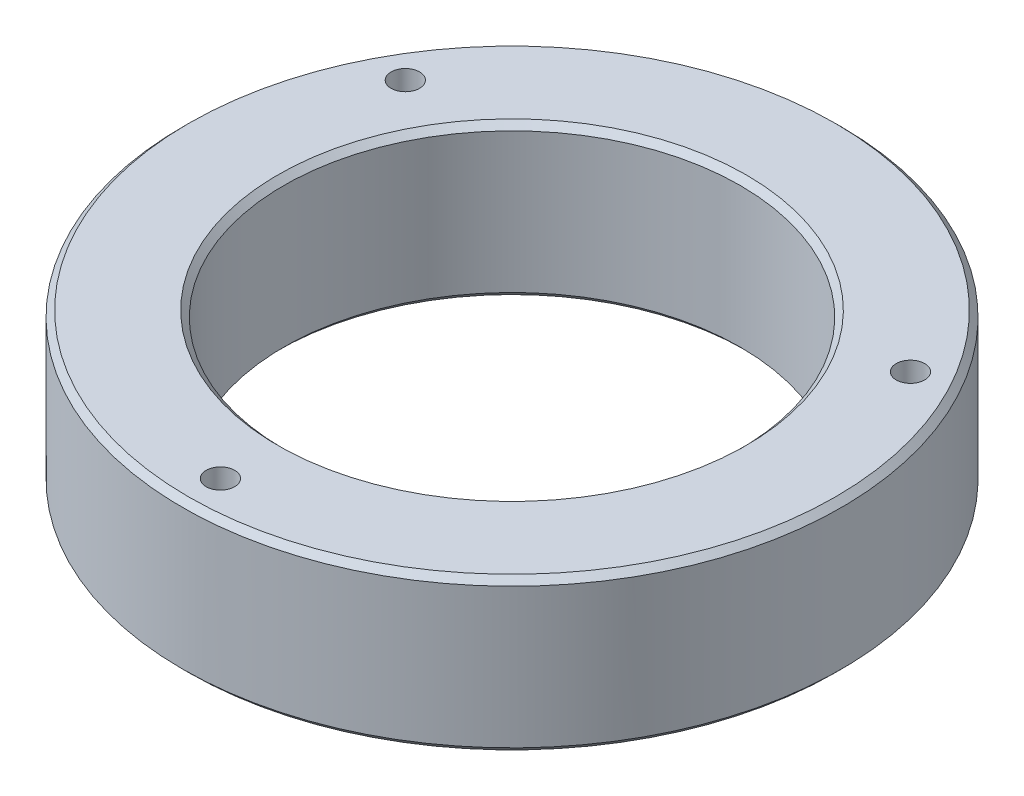
ISO-10303-21;
HEADER;
FILE_DESCRIPTION(('STEP AP214'),'2;1');
FILE_NAME('part.step','',(''),(''),'','','');
FILE_SCHEMA(('AUTOMOTIVE_DESIGN { 1 0 10303 214 1 1 1 1 }'));
ENDSEC;
DATA;
#1=APPLICATION_CONTEXT('core data for automotive mechanical design processes');
#2=APPLICATION_PROTOCOL_DEFINITION('international standard','automotive_design',2000,#1);
#3=PRODUCT_CONTEXT('',#1,'mechanical');
#4=PRODUCT('Part','Part','',(#3));
#5=PRODUCT_RELATED_PRODUCT_CATEGORY('part','',(#4));
#6=PRODUCT_DEFINITION_FORMATION('','',#4);
#7=PRODUCT_DEFINITION_CONTEXT('part definition',#1,'design');
#8=PRODUCT_DEFINITION('design','',#6,#7);
#9=PRODUCT_DEFINITION_SHAPE('','',#8);
#10=(LENGTH_UNIT() NAMED_UNIT(*) SI_UNIT(.MILLI.,.METRE.));
#11=(NAMED_UNIT(*) PLANE_ANGLE_UNIT() SI_UNIT($,.RADIAN.));
#12=(NAMED_UNIT(*) SI_UNIT($,.STERADIAN.) SOLID_ANGLE_UNIT());
#13=UNCERTAINTY_MEASURE_WITH_UNIT(LENGTH_MEASURE(1.E-05),#10,'distance_accuracy_value','');
#14=(GEOMETRIC_REPRESENTATION_CONTEXT(3) GLOBAL_UNCERTAINTY_ASSIGNED_CONTEXT((#13)) GLOBAL_UNIT_ASSIGNED_CONTEXT((#10,
#11,#12)) REPRESENTATION_CONTEXT('',''));
#15=CARTESIAN_POINT('',(0.,0.,0.));
#16=DIRECTION('',(0.,0.,1.));
#17=DIRECTION('',(1.,0.,0.));
#18=AXIS2_PLACEMENT_3D('',#15,#16,#17);
#19=CARTESIAN_POINT('',(-57.15,-19.05,0.));
#20=DIRECTION('',(0.,1.,0.));
#21=DIRECTION('',(0.,0.,1.));
#22=AXIS2_PLACEMENT_3D('',#19,#20,#21);
#23=PLANE('',#22);
#24=CARTESIAN_POINT('',(69.85,-19.05,0.));
#25=DIRECTION('',(0.,-1.,0.));
#26=DIRECTION('',(0.,0.,-1.));
#27=AXIS2_PLACEMENT_3D('',#24,#25,#26);
#28=CIRCLE('',#27,3.96874999999999);
#29=CARTESIAN_POINT('',(69.85,-19.05,-3.96874999999999));
#30=VERTEX_POINT('',#29);
#31=EDGE_CURVE('E73',#30,#30,#28,.T.);
#32=ORIENTED_EDGE('',*,*,#31,.F.);
#33=EDGE_LOOP('',(#32));
#34=FACE_BOUND('',#33,.T.);
#35=CARTESIAN_POINT('',(-69.85,-19.05,0.));
#36=DIRECTION('',(0.,-1.,0.));
#37=DIRECTION('',(0.,0.,-1.));
#38=AXIS2_PLACEMENT_3D('',#35,#36,#37);
#39=CIRCLE('',#38,3.96874999999999);
#40=CARTESIAN_POINT('',(-69.85,-19.05,-3.96874999999999));
#41=VERTEX_POINT('',#40);
#42=EDGE_CURVE('E72',#41,#41,#39,.T.);
#43=ORIENTED_EDGE('',*,*,#42,.F.);
#44=EDGE_LOOP('',(#43));
#45=FACE_BOUND('',#44,.T.);
#46=CARTESIAN_POINT('',(0.,-19.05,73.025));
#47=DIRECTION('',(0.,-1.,0.));
#48=DIRECTION('',(0.,0.,-1.));
#49=AXIS2_PLACEMENT_3D('',#46,#47,#48);
#50=CIRCLE('',#49,5.56259999999999);
#51=CARTESIAN_POINT('',(0.,-19.05,67.4624));
#52=VERTEX_POINT('',#51);
#53=EDGE_CURVE('E83',#52,#52,#50,.T.);
#54=ORIENTED_EDGE('',*,*,#53,.F.);
#55=EDGE_LOOP('',(#54));
#56=FACE_BOUND('',#55,.T.);
#57=CARTESIAN_POINT('',(63.246,-19.05,-36.5252));
#58=DIRECTION('',(0.,-1.,0.));
#59=DIRECTION('',(0.,0.,-1.));
#60=AXIS2_PLACEMENT_3D('',#57,#58,#59);
#61=CIRCLE('',#60,5.5626);
#62=CARTESIAN_POINT('',(63.246,-19.05,-42.0878));
#63=VERTEX_POINT('',#62);
#64=EDGE_CURVE('E95',#63,#63,#61,.T.);
#65=ORIENTED_EDGE('',*,*,#64,.F.);
#66=EDGE_LOOP('',(#65));
#67=FACE_BOUND('',#66,.T.);
#68=CARTESIAN_POINT('',(-63.246,-19.05,-36.5252));
#69=DIRECTION('',(0.,-1.,0.));
#70=DIRECTION('',(0.,0.,-1.));
#71=AXIS2_PLACEMENT_3D('',#68,#69,#70);
#72=CIRCLE('',#71,5.56259999999999);
#73=CARTESIAN_POINT('',(-63.246,-19.05,-42.0878));
#74=VERTEX_POINT('',#73);
#75=EDGE_CURVE('E107',#74,#74,#72,.T.);
#76=ORIENTED_EDGE('',*,*,#75,.F.);
#77=EDGE_LOOP('',(#76));
#78=FACE_BOUND('',#77,.T.);
#79=CARTESIAN_POINT('',(0.,-19.05,0.));
#80=DIRECTION('',(0.,1.,0.));
#81=DIRECTION('',(0.,0.,1.));
#82=AXIS2_PLACEMENT_3D('',#79,#80,#81);
#83=CIRCLE('',#82,58.674);
#84=CARTESIAN_POINT('',(0.,-19.05,-58.674));
#85=VERTEX_POINT('',#84);
#86=EDGE_CURVE('E134',#85,#85,#83,.T.);
#87=ORIENTED_EDGE('',*,*,#86,.T.);
#88=EDGE_LOOP('',(#87));
#89=FACE_BOUND('',#88,.T.);
#90=CARTESIAN_POINT('',(0.,-19.05,0.));
#91=DIRECTION('',(0.,1.,0.));
#92=DIRECTION('',(0.,0.,1.));
#93=AXIS2_PLACEMENT_3D('',#90,#91,#92);
#94=CIRCLE('',#93,81.0006);
#95=CARTESIAN_POINT('',(0.,-19.05,81.0006));
#96=VERTEX_POINT('',#95);
#97=EDGE_CURVE('E131',#96,#96,#94,.F.);
#98=ORIENTED_EDGE('',*,*,#97,.T.);
#99=EDGE_LOOP('',(#98));
#100=FACE_BOUND('',#99,.T.);
#101=ADVANCED_FACE('F47',(#34,#45,#56,#67,#78,#89,#100),#23,.F.);
#102=CARTESIAN_POINT('',(0.,-44.45,0.));
#103=DIRECTION('',(0.,-1.,0.));
#104=DIRECTION('',(0.,0.,-1.));
#105=AXIS2_PLACEMENT_3D('',#102,#103,#104);
#106=CYLINDRICAL_SURFACE('',#105,82.5246);
#107=CARTESIAN_POINT('',(0.,17.526,0.));
#108=DIRECTION('',(0.,-1.,0.));
#109=DIRECTION('',(0.,0.,-1.));
#110=AXIS2_PLACEMENT_3D('',#107,#108,#109);
#111=CIRCLE('',#110,82.5246);
#112=CARTESIAN_POINT('',(0.,17.526,-82.5246));
#113=VERTEX_POINT('',#112);
#114=EDGE_CURVE('E11',#113,#113,#111,.T.);
#115=ORIENTED_EDGE('',*,*,#114,.T.);
#116=EDGE_LOOP('',(#115));
#117=FACE_BOUND('',#116,.T.);
#118=CARTESIAN_POINT('',(0.,-17.526,0.));
#119=DIRECTION('',(0.,1.,0.));
#120=DIRECTION('',(0.,0.,1.));
#121=AXIS2_PLACEMENT_3D('',#118,#119,#120);
#122=CIRCLE('',#121,82.5246);
#123=CARTESIAN_POINT('',(0.,-17.526,82.5246));
#124=VERTEX_POINT('',#123);
#125=EDGE_CURVE('E56',#124,#124,#122,.T.);
#126=ORIENTED_EDGE('',*,*,#125,.T.);
#127=EDGE_LOOP('',(#126));
#128=FACE_BOUND('',#127,.T.);
#129=ADVANCED_FACE('F139',(#117,#128),#106,.T.);
#130=CARTESIAN_POINT('',(-82.5246,19.05,0.));
#131=DIRECTION('',(0.,-1.,0.));
#132=DIRECTION('',(0.,0.,-1.));
#133=AXIS2_PLACEMENT_3D('',#130,#131,#132);
#134=PLANE('',#133);
#135=CARTESIAN_POINT('',(0.,19.05,73.025));
#136=DIRECTION('',(0.,-1.,0.));
#137=DIRECTION('',(0.,0.,-1.));
#138=AXIS2_PLACEMENT_3D('',#135,#136,#137);
#139=CIRCLE('',#138,3.56869999999999);
#140=CARTESIAN_POINT('',(0.,19.05,69.4563));
#141=VERTEX_POINT('',#140);
#142=EDGE_CURVE('E92',#141,#141,#139,.T.);
#143=ORIENTED_EDGE('',*,*,#142,.T.);
#144=EDGE_LOOP('',(#143));
#145=FACE_BOUND('',#144,.T.);
#146=CARTESIAN_POINT('',(63.246,19.05,-36.5252));
#147=DIRECTION('',(0.,-1.,0.));
#148=DIRECTION('',(0.,0.,-1.));
#149=AXIS2_PLACEMENT_3D('',#146,#147,#148);
#150=CIRCLE('',#149,3.56869999999999);
#151=CARTESIAN_POINT('',(63.246,19.05,-40.0939));
#152=VERTEX_POINT('',#151);
#153=EDGE_CURVE('E104',#152,#152,#150,.T.);
#154=ORIENTED_EDGE('',*,*,#153,.T.);
#155=EDGE_LOOP('',(#154));
#156=FACE_BOUND('',#155,.T.);
#157=CARTESIAN_POINT('',(-63.246,19.05,-36.5252));
#158=DIRECTION('',(0.,-1.,0.));
#159=DIRECTION('',(0.,0.,-1.));
#160=AXIS2_PLACEMENT_3D('',#157,#158,#159);
#161=CIRCLE('',#160,3.56869999999999);
#162=CARTESIAN_POINT('',(-63.246,19.05,-40.0939));
#163=VERTEX_POINT('',#162);
#164=EDGE_CURVE('E116',#163,#163,#161,.T.);
#165=ORIENTED_EDGE('',*,*,#164,.T.);
#166=EDGE_LOOP('',(#165));
#167=FACE_BOUND('',#166,.T.);
#168=CARTESIAN_POINT('',(0.,19.05,0.));
#169=DIRECTION('',(0.,-1.,0.));
#170=DIRECTION('',(0.,0.,-1.));
#171=AXIS2_PLACEMENT_3D('',#168,#169,#170);
#172=CIRCLE('',#171,58.674);
#173=CARTESIAN_POINT('',(0.,19.05,-58.674));
#174=VERTEX_POINT('',#173);
#175=EDGE_CURVE('E122',#174,#174,#172,.T.);
#176=ORIENTED_EDGE('',*,*,#175,.T.);
#177=EDGE_LOOP('',(#176));
#178=FACE_BOUND('',#177,.T.);
#179=CARTESIAN_POINT('',(0.,19.05,0.));
#180=DIRECTION('',(0.,-1.,0.));
#181=DIRECTION('',(0.,0.,-1.));
#182=AXIS2_PLACEMENT_3D('',#179,#180,#181);
#183=CIRCLE('',#182,81.0006);
#184=CARTESIAN_POINT('',(0.,19.05,-81.0006));
#185=VERTEX_POINT('',#184);
#186=EDGE_CURVE('E119',#185,#185,#183,.F.);
#187=ORIENTED_EDGE('',*,*,#186,.T.);
#188=EDGE_LOOP('',(#187));
#189=FACE_BOUND('',#188,.T.);
#190=ADVANCED_FACE('F153',(#145,#156,#167,#178,#189),#134,.F.);
#191=CARTESIAN_POINT('',(0.,-44.45,0.));
#192=DIRECTION('',(0.,-1.,0.));
#193=DIRECTION('',(0.,0.,-1.));
#194=AXIS2_PLACEMENT_3D('',#191,#192,#193);
#195=CYLINDRICAL_SURFACE('',#194,57.15);
#196=CARTESIAN_POINT('',(0.,17.526,0.));
#197=DIRECTION('',(0.,-1.,0.));
#198=DIRECTION('',(0.,0.,-1.));
#199=AXIS2_PLACEMENT_3D('',#196,#197,#198);
#200=CIRCLE('',#199,57.15);
#201=CARTESIAN_POINT('',(0.,17.526,-57.15));
#202=VERTEX_POINT('',#201);
#203=EDGE_CURVE('E128',#202,#202,#200,.F.);
#204=CARTESIAN_POINT('',(0.,-17.526,0.));
#205=DIRECTION('',(0.,1.,0.));
#206=DIRECTION('',(0.,0.,1.));
#207=AXIS2_PLACEMENT_3D('',#204,#205,#206);
#208=CIRCLE('',#207,57.15);
#209=CARTESIAN_POINT('',(0.,-17.526,-57.15));
#210=VERTEX_POINT('',#209);
#211=EDGE_CURVE('E125',#210,#210,#208,.F.);
#212=CARTESIAN_POINT('',(0.,17.526,-57.15));
#213=CARTESIAN_POINT('',(0.,17.160875,-57.15));
#214=CARTESIAN_POINT('',(0.,16.79575,-57.15));
#215=CARTESIAN_POINT('',(0.,16.0655,-57.15));
#216=CARTESIAN_POINT('',(0.,15.700375,-57.15));
#217=CARTESIAN_POINT('',(0.,14.970125,-57.15));
#218=CARTESIAN_POINT('',(0.,14.605,-57.15));
#219=CARTESIAN_POINT('',(0.,13.87475,-57.15));
#220=CARTESIAN_POINT('',(0.,13.509625,-57.15));
#221=CARTESIAN_POINT('',(0.,12.779375,-57.15));
#222=CARTESIAN_POINT('',(0.,12.41425,-57.15));
#223=CARTESIAN_POINT('',(0.,11.684,-57.15));
#224=CARTESIAN_POINT('',(0.,11.318875,-57.15));
#225=CARTESIAN_POINT('',(0.,10.588625,-57.15));
#226=CARTESIAN_POINT('',(0.,10.2235,-57.15));
#227=CARTESIAN_POINT('',(0.,9.49324999999998,-57.15));
#228=CARTESIAN_POINT('',(0.,9.12812499999998,-57.15));
#229=CARTESIAN_POINT('',(0.,8.39787499999998,-57.15));
#230=CARTESIAN_POINT('',(0.,8.03274999999998,-57.15));
#231=CARTESIAN_POINT('',(0.,7.30249999999998,-57.15));
#232=CARTESIAN_POINT('',(0.,6.93737499999998,-57.15));
#233=CARTESIAN_POINT('',(0.,6.20712499999998,-57.15));
#234=CARTESIAN_POINT('',(0.,5.84199999999998,-57.15));
#235=CARTESIAN_POINT('',(0.,5.11174999999998,-57.15));
#236=CARTESIAN_POINT('',(0.,4.74662499999998,-57.15));
#237=CARTESIAN_POINT('',(0.,4.01637499999998,-57.15));
#238=CARTESIAN_POINT('',(0.,3.65124999999998,-57.15));
#239=CARTESIAN_POINT('',(0.,2.92099999999998,-57.15));
#240=CARTESIAN_POINT('',(0.,2.55587499999998,-57.15));
#241=CARTESIAN_POINT('',(0.,1.82562499999998,-57.15));
#242=CARTESIAN_POINT('',(0.,1.46049999999998,-57.15));
#243=CARTESIAN_POINT('',(0.,0.730249999999976,-57.15));
#244=CARTESIAN_POINT('',(0.,0.365124999999978,-57.15));
#245=CARTESIAN_POINT('',(0.,-0.365125000000019,-57.15));
#246=CARTESIAN_POINT('',(0.,-0.730250000000018,-57.15));
#247=CARTESIAN_POINT('',(0.,-1.46050000000002,-57.15));
#248=CARTESIAN_POINT('',(0.,-1.82562500000002,-57.15));
#249=CARTESIAN_POINT('',(0.,-2.55587500000002,-57.15));
#250=CARTESIAN_POINT('',(0.,-2.92100000000002,-57.15));
#251=CARTESIAN_POINT('',(0.,-3.65125000000002,-57.15));
#252=CARTESIAN_POINT('',(0.,-4.01637500000002,-57.15));
#253=CARTESIAN_POINT('',(0.,-4.74662500000002,-57.15));
#254=CARTESIAN_POINT('',(0.,-5.11175000000002,-57.15));
#255=CARTESIAN_POINT('',(0.,-5.84200000000002,-57.15));
#256=CARTESIAN_POINT('',(0.,-6.20712500000002,-57.15));
#257=CARTESIAN_POINT('',(0.,-6.93737500000002,-57.15));
#258=CARTESIAN_POINT('',(0.,-7.30250000000002,-57.15));
#259=CARTESIAN_POINT('',(0.,-8.03275000000002,-57.15));
#260=CARTESIAN_POINT('',(0.,-8.39787500000002,-57.15));
#261=CARTESIAN_POINT('',(0.,-9.12812500000002,-57.15));
#262=CARTESIAN_POINT('',(0.,-9.49325000000002,-57.15));
#263=CARTESIAN_POINT('',(0.,-10.2235,-57.15));
#264=CARTESIAN_POINT('',(0.,-10.588625,-57.15));
#265=CARTESIAN_POINT('',(0.,-11.318875,-57.15));
#266=CARTESIAN_POINT('',(0.,-11.684,-57.15));
#267=CARTESIAN_POINT('',(0.,-12.41425,-57.15));
#268=CARTESIAN_POINT('',(0.,-12.779375,-57.15));
#269=CARTESIAN_POINT('',(0.,-13.509625,-57.15));
#270=CARTESIAN_POINT('',(0.,-13.87475,-57.15));
#271=CARTESIAN_POINT('',(0.,-14.605,-57.15));
#272=CARTESIAN_POINT('',(0.,-14.970125,-57.15));
#273=CARTESIAN_POINT('',(0.,-15.700375,-57.15));
#274=CARTESIAN_POINT('',(0.,-16.0655,-57.15));
#275=CARTESIAN_POINT('',(0.,-16.79575,-57.15));
#276=CARTESIAN_POINT('',(0.,-17.160875,-57.15));
#277=CARTESIAN_POINT('',(0.,-17.526,-57.15));
#278=B_SPLINE_CURVE_WITH_KNOTS('',3,(#212,#213,#214,#215,#216,#217,#218,#219,#220,#221,#222,
#223,#224,#225,#226,#227,#228,#229,#230,#231,#232,#233,#234,#235,#236,#237,#238,#239,#240,#241,
#242,#243,#244,#245,#246,#247,#248,#249,#250,#251,#252,#253,#254,#255,#256,#257,#258,#259,#260,
#261,#262,#263,#264,#265,#266,#267,#268,#269,#270,#271,#272,#273,#274,#275,#276,#277),
.UNSPECIFIED.,.F.,.F.,(4,2,2,2,2,2,2,2,2,2,2,2,2,2,2,2,2,2,2,2,2,2,2,2,2,2,2,2,2,2,2,2,4),(0.,
1.095375,2.19075,3.286125,4.3815,5.476875,6.57225,7.667625,8.763,9.858375,10.95375,12.049125,
13.1445,14.239875,15.33525,16.430625,17.526,18.621375,19.71675,20.812125,21.9075,23.002875,
24.09825,25.193625,26.289,27.384375,28.47975,29.575125,30.6705,31.765875,32.86125,33.956625,
35.052),.UNSPECIFIED.);
#279=EDGE_CURVE('BSEAM168',#202,#210,#278,.T.);
#280=ORIENTED_EDGE('',*,*,#203,.T.);
#281=ORIENTED_EDGE('',*,*,#211,.T.);
#282=ORIENTED_EDGE('',*,*,#279,.T.);
#283=ORIENTED_EDGE('',*,*,#279,.F.);
#284=EDGE_LOOP('',(#280,#282,#281,#283));
#285=FACE_BOUND('',#284,.T.);
#286=ADVANCED_FACE('F168',(#285),#195,.F.);
#287=CARTESIAN_POINT('',(0.,19.05,0.));
#288=DIRECTION('',(0.,1.,0.));
#289=DIRECTION('',(0.,0.,1.));
#290=AXIS2_PLACEMENT_3D('',#287,#288,#289);
#291=CONICAL_SURFACE('',#290,58.674,0.785398163397435);
#292=ORIENTED_EDGE('',*,*,#203,.F.);
#293=EDGE_LOOP('',(#292));
#294=FACE_BOUND('',#293,.T.);
#295=ORIENTED_EDGE('',*,*,#175,.F.);
#296=EDGE_LOOP('',(#295));
#297=FACE_BOUND('',#296,.T.);
#298=ADVANCED_FACE('F161',(#294,#297),#291,.F.);
#299=CARTESIAN_POINT('',(0.,-17.526,0.));
#300=DIRECTION('',(0.,-1.,0.));
#301=DIRECTION('',(0.,0.,-1.));
#302=AXIS2_PLACEMENT_3D('',#299,#300,#301);
#303=CONICAL_SURFACE('',#302,57.15,0.785398163397451);
#304=CARTESIAN_POINT('',(0.,-19.05,-58.674));
#305=CARTESIAN_POINT('',(0.,-19.034125,-58.658125));
#306=CARTESIAN_POINT('',(0.,-19.01825,-58.64225));
#307=CARTESIAN_POINT('',(0.,-18.9865,-58.6105));
#308=CARTESIAN_POINT('',(0.,-18.970625,-58.594625));
#309=CARTESIAN_POINT('',(0.,-18.938875,-58.562875));
#310=CARTESIAN_POINT('',(0.,-18.923,-58.547));
#311=CARTESIAN_POINT('',(0.,-18.89125,-58.51525));
#312=CARTESIAN_POINT('',(0.,-18.875375,-58.499375));
#313=CARTESIAN_POINT('',(0.,-18.843625,-58.467625));
#314=CARTESIAN_POINT('',(0.,-18.82775,-58.45175));
#315=CARTESIAN_POINT('',(0.,-18.796,-58.42));
#316=CARTESIAN_POINT('',(0.,-18.780125,-58.404125));
#317=CARTESIAN_POINT('',(0.,-18.748375,-58.372375));
#318=CARTESIAN_POINT('',(0.,-18.7325,-58.3565));
#319=CARTESIAN_POINT('',(0.,-18.70075,-58.32475));
#320=CARTESIAN_POINT('',(0.,-18.684875,-58.308875));
#321=CARTESIAN_POINT('',(0.,-18.653125,-58.277125));
#322=CARTESIAN_POINT('',(0.,-18.63725,-58.26125));
#323=CARTESIAN_POINT('',(0.,-18.6055,-58.2295));
#324=CARTESIAN_POINT('',(0.,-18.589625,-58.213625));
#325=CARTESIAN_POINT('',(0.,-18.557875,-58.181875));
#326=CARTESIAN_POINT('',(0.,-18.542,-58.166));
#327=CARTESIAN_POINT('',(0.,-18.51025,-58.13425));
#328=CARTESIAN_POINT('',(0.,-18.494375,-58.118375));
#329=CARTESIAN_POINT('',(0.,-18.462625,-58.086625));
#330=CARTESIAN_POINT('',(0.,-18.44675,-58.07075));
#331=CARTESIAN_POINT('',(0.,-18.415,-58.039));
#332=CARTESIAN_POINT('',(0.,-18.399125,-58.023125));
#333=CARTESIAN_POINT('',(0.,-18.367375,-57.991375));
#334=CARTESIAN_POINT('',(0.,-18.3515,-57.9755));
#335=CARTESIAN_POINT('',(0.,-18.31975,-57.94375));
#336=CARTESIAN_POINT('',(0.,-18.303875,-57.927875));
#337=CARTESIAN_POINT('',(0.,-18.272125,-57.896125));
#338=CARTESIAN_POINT('',(0.,-18.25625,-57.88025));
#339=CARTESIAN_POINT('',(0.,-18.2245,-57.8485));
#340=CARTESIAN_POINT('',(0.,-18.208625,-57.832625));
#341=CARTESIAN_POINT('',(0.,-18.176875,-57.800875));
#342=CARTESIAN_POINT('',(0.,-18.161,-57.785));
#343=CARTESIAN_POINT('',(0.,-18.12925,-57.75325));
#344=CARTESIAN_POINT('',(0.,-18.113375,-57.737375));
#345=CARTESIAN_POINT('',(0.,-18.081625,-57.705625));
#346=CARTESIAN_POINT('',(0.,-18.06575,-57.68975));
#347=CARTESIAN_POINT('',(0.,-18.034,-57.658));
#348=CARTESIAN_POINT('',(0.,-18.018125,-57.642125));
#349=CARTESIAN_POINT('',(0.,-17.986375,-57.610375));
#350=CARTESIAN_POINT('',(0.,-17.9705,-57.5945));
#351=CARTESIAN_POINT('',(0.,-17.93875,-57.56275));
#352=CARTESIAN_POINT('',(0.,-17.922875,-57.546875));
#353=CARTESIAN_POINT('',(0.,-17.891125,-57.515125));
#354=CARTESIAN_POINT('',(0.,-17.87525,-57.49925));
#355=CARTESIAN_POINT('',(0.,-17.8435,-57.4675));
#356=CARTESIAN_POINT('',(0.,-17.827625,-57.451625));
#357=CARTESIAN_POINT('',(0.,-17.795875,-57.419875));
#358=CARTESIAN_POINT('',(0.,-17.78,-57.404));
#359=CARTESIAN_POINT('',(0.,-17.74825,-57.37225));
#360=CARTESIAN_POINT('',(0.,-17.732375,-57.356375));
#361=CARTESIAN_POINT('',(0.,-17.700625,-57.324625));
#362=CARTESIAN_POINT('',(0.,-17.68475,-57.30875));
#363=CARTESIAN_POINT('',(0.,-17.653,-57.277));
#364=CARTESIAN_POINT('',(0.,-17.637125,-57.261125));
#365=CARTESIAN_POINT('',(0.,-17.605375,-57.229375));
#366=CARTESIAN_POINT('',(0.,-17.5895,-57.2135));
#367=CARTESIAN_POINT('',(0.,-17.55775,-57.18175));
#368=CARTESIAN_POINT('',(0.,-17.541875,-57.165875));
#369=CARTESIAN_POINT('',(0.,-17.526,-57.15));
#370=B_SPLINE_CURVE_WITH_KNOTS('',3,(#304,#305,#306,#307,#308,#309,#310,#311,#312,#313,#314,
#315,#316,#317,#318,#319,#320,#321,#322,#323,#324,#325,#326,#327,#328,#329,#330,#331,#332,#333,
#334,#335,#336,#337,#338,#339,#340,#341,#342,#343,#344,#345,#346,#347,#348,#349,#350,#351,#352,
#353,#354,#355,#356,#357,#358,#359,#360,#361,#362,#363,#364,#365,#366,#367,#368,#369),
.UNSPECIFIED.,.F.,.F.,(4,2,2,2,2,2,2,2,2,2,2,2,2,2,2,2,2,2,2,2,2,2,2,2,2,2,2,2,2,2,2,2,4),(0.,
0.0673519209080149,0.134703841816037,0.202055762724052,0.269407683632072,0.336759604540087,
0.404111525448106,0.471463446356126,0.538815367264141,0.606167288172161,0.673519209080176,
0.740871129988195,0.80822305089621,0.87557497180423,0.94292689271225,1.01027881362026,
1.07763073452828,1.1449826554363,1.21233457634432,1.27968649725234,1.34703841816036,
1.41439033906838,1.48174225997639,1.54909418088441,1.61644610179242,1.68379802270044,
1.75114994360846,1.81850186451648,1.88585378542449,1.95320570633251,2.02055762724053,
2.08790954814855,2.15526146905657),.UNSPECIFIED.);
#371=EDGE_CURVE('BSEAM167',#85,#210,#370,.T.);
#372=ORIENTED_EDGE('',*,*,#86,.F.);
#373=ORIENTED_EDGE('',*,*,#211,.F.);
#374=ORIENTED_EDGE('',*,*,#371,.T.);
#375=ORIENTED_EDGE('',*,*,#371,.F.);
#376=EDGE_LOOP('',(#372,#374,#373,#375));
#377=FACE_BOUND('',#376,.T.);
#378=ADVANCED_FACE('F167',(#377),#303,.F.);
#379=CARTESIAN_POINT('',(0.,17.526,0.));
#380=DIRECTION('',(0.,-1.,0.));
#381=DIRECTION('',(0.,0.,-1.));
#382=AXIS2_PLACEMENT_3D('',#379,#380,#381);
#383=CONICAL_SURFACE('',#382,82.5246,0.785398163397451);
#384=ORIENTED_EDGE('',*,*,#186,.F.);
#385=EDGE_LOOP('',(#384));
#386=FACE_BOUND('',#385,.T.);
#387=ORIENTED_EDGE('',*,*,#114,.F.);
#388=EDGE_LOOP('',(#387));
#389=FACE_BOUND('',#388,.T.);
#390=ADVANCED_FACE('F144',(#386,#389),#383,.T.);
#391=CARTESIAN_POINT('',(0.,-19.05,0.));
#392=DIRECTION('',(0.,1.,0.));
#393=DIRECTION('',(0.,0.,1.));
#394=AXIS2_PLACEMENT_3D('',#391,#392,#393);
#395=CONICAL_SURFACE('',#394,81.0006,0.785398163397448);
#396=ORIENTED_EDGE('',*,*,#125,.F.);
#397=EDGE_LOOP('',(#396));
#398=FACE_BOUND('',#397,.T.);
#399=ORIENTED_EDGE('',*,*,#97,.F.);
#400=EDGE_LOOP('',(#399));
#401=FACE_BOUND('',#400,.T.);
#402=ADVANCED_FACE('F50',(#398,#401),#395,.T.);
#403=CARTESIAN_POINT('',(-63.246,-19.05,-36.5252));
#404=DIRECTION('',(0.,-1.,0.));
#405=DIRECTION('',(0.,0.,-1.));
#406=AXIS2_PLACEMENT_3D('',#403,#404,#405);
#407=CYLINDRICAL_SURFACE('',#406,3.56869999999999);
#408=ORIENTED_EDGE('',*,*,#164,.F.);
#409=EDGE_LOOP('',(#408));
#410=FACE_BOUND('',#409,.T.);
#411=CARTESIAN_POINT('',(-63.246,-9.39800000000001,-36.5252));
#412=DIRECTION('',(0.,-1.,0.));
#413=DIRECTION('',(0.,0.,-1.));
#414=AXIS2_PLACEMENT_3D('',#411,#412,#413);
#415=CIRCLE('',#414,3.56869999999999);
#416=CARTESIAN_POINT('',(-63.246,-9.39800000000001,-40.0939));
#417=VERTEX_POINT('',#416);
#418=EDGE_CURVE('E113',#417,#417,#415,.T.);
#419=ORIENTED_EDGE('',*,*,#418,.T.);
#420=EDGE_LOOP('',(#419));
#421=FACE_BOUND('',#420,.T.);
#422=ADVANCED_FACE('F143',(#410,#421),#407,.F.);
#423=CARTESIAN_POINT('',(-59.6773,-9.398,-36.5252));
#424=DIRECTION('',(0.,1.,0.));
#425=DIRECTION('',(0.,0.,1.));
#426=AXIS2_PLACEMENT_3D('',#423,#424,#425);
#427=PLANE('',#426);
#428=ORIENTED_EDGE('',*,*,#418,.F.);
#429=EDGE_LOOP('',(#428));
#430=FACE_BOUND('',#429,.T.);
#431=CARTESIAN_POINT('',(-63.246,-9.398,-36.5252));
#432=DIRECTION('',(0.,-1.,0.));
#433=DIRECTION('',(0.,0.,-1.));
#434=AXIS2_PLACEMENT_3D('',#431,#432,#433);
#435=CIRCLE('',#434,5.56259999999999);
#436=CARTESIAN_POINT('',(-63.246,-9.398,-42.0878));
#437=VERTEX_POINT('',#436);
#438=EDGE_CURVE('E110',#437,#437,#435,.T.);
#439=ORIENTED_EDGE('',*,*,#438,.T.);
#440=EDGE_LOOP('',(#439));
#441=FACE_BOUND('',#440,.T.);
#442=ADVANCED_FACE('F196',(#430,#441),#427,.F.);
#443=CARTESIAN_POINT('',(-63.246,-19.05,-36.5252));
#444=DIRECTION('',(0.,-1.,0.));
#445=DIRECTION('',(0.,0.,-1.));
#446=AXIS2_PLACEMENT_3D('',#443,#444,#445);
#447=CYLINDRICAL_SURFACE('',#446,5.56259999999999);
#448=ORIENTED_EDGE('',*,*,#438,.F.);
#449=EDGE_LOOP('',(#448));
#450=FACE_BOUND('',#449,.T.);
#451=ORIENTED_EDGE('',*,*,#75,.T.);
#452=EDGE_LOOP('',(#451));
#453=FACE_BOUND('',#452,.T.);
#454=ADVANCED_FACE('F200',(#450,#453),#447,.F.);
#455=CARTESIAN_POINT('',(63.246,-19.05,-36.5252));
#456=DIRECTION('',(0.,-1.,0.));
#457=DIRECTION('',(0.,0.,-1.));
#458=AXIS2_PLACEMENT_3D('',#455,#456,#457);
#459=CYLINDRICAL_SURFACE('',#458,3.56869999999999);
#460=ORIENTED_EDGE('',*,*,#153,.F.);
#461=EDGE_LOOP('',(#460));
#462=FACE_BOUND('',#461,.T.);
#463=CARTESIAN_POINT('',(63.246,-9.39800000000001,-36.5252));
#464=DIRECTION('',(0.,-1.,0.));
#465=DIRECTION('',(0.,0.,-1.));
#466=AXIS2_PLACEMENT_3D('',#463,#464,#465);
#467=CIRCLE('',#466,3.56869999999998);
#468=CARTESIAN_POINT('',(63.246,-9.39800000000001,-40.0939));
#469=VERTEX_POINT('',#468);
#470=EDGE_CURVE('E101',#469,#469,#467,.T.);
#471=ORIENTED_EDGE('',*,*,#470,.T.);
#472=EDGE_LOOP('',(#471));
#473=FACE_BOUND('',#472,.T.);
#474=ADVANCED_FACE('F204',(#462,#473),#459,.F.);
#475=CARTESIAN_POINT('',(66.8147,-9.398,-36.5252));
#476=DIRECTION('',(0.,1.,0.));
#477=DIRECTION('',(0.,0.,1.));
#478=AXIS2_PLACEMENT_3D('',#475,#476,#477);
#479=PLANE('',#478);
#480=ORIENTED_EDGE('',*,*,#470,.F.);
#481=EDGE_LOOP('',(#480));
#482=FACE_BOUND('',#481,.T.);
#483=CARTESIAN_POINT('',(63.246,-9.398,-36.5252));
#484=DIRECTION('',(0.,-1.,0.));
#485=DIRECTION('',(0.,0.,-1.));
#486=AXIS2_PLACEMENT_3D('',#483,#484,#485);
#487=CIRCLE('',#486,5.5626);
#488=CARTESIAN_POINT('',(63.246,-9.398,-42.0878));
#489=VERTEX_POINT('',#488);
#490=EDGE_CURVE('E98',#489,#489,#487,.T.);
#491=ORIENTED_EDGE('',*,*,#490,.T.);
#492=EDGE_LOOP('',(#491));
#493=FACE_BOUND('',#492,.T.);
#494=ADVANCED_FACE('F208',(#482,#493),#479,.F.);
#495=CARTESIAN_POINT('',(63.246,-19.05,-36.5252));
#496=DIRECTION('',(0.,-1.,0.));
#497=DIRECTION('',(0.,0.,-1.));
#498=AXIS2_PLACEMENT_3D('',#495,#496,#497);
#499=CYLINDRICAL_SURFACE('',#498,5.5626);
#500=ORIENTED_EDGE('',*,*,#490,.F.);
#501=EDGE_LOOP('',(#500));
#502=FACE_BOUND('',#501,.T.);
#503=ORIENTED_EDGE('',*,*,#64,.T.);
#504=EDGE_LOOP('',(#503));
#505=FACE_BOUND('',#504,.T.);
#506=ADVANCED_FACE('F212',(#502,#505),#499,.F.);
#507=CARTESIAN_POINT('',(0.,-19.05,73.025));
#508=DIRECTION('',(0.,-1.,0.));
#509=DIRECTION('',(0.,0.,-1.));
#510=AXIS2_PLACEMENT_3D('',#507,#508,#509);
#511=CYLINDRICAL_SURFACE('',#510,3.56869999999999);
#512=ORIENTED_EDGE('',*,*,#142,.F.);
#513=EDGE_LOOP('',(#512));
#514=FACE_BOUND('',#513,.T.);
#515=CARTESIAN_POINT('',(0.,-9.39800000000001,73.025));
#516=DIRECTION('',(0.,-1.,0.));
#517=DIRECTION('',(0.,0.,-1.));
#518=AXIS2_PLACEMENT_3D('',#515,#516,#517);
#519=CIRCLE('',#518,3.56869999999999);
#520=CARTESIAN_POINT('',(0.,-9.39800000000001,69.4563));
#521=VERTEX_POINT('',#520);
#522=EDGE_CURVE('E89',#521,#521,#519,.T.);
#523=ORIENTED_EDGE('',*,*,#522,.T.);
#524=EDGE_LOOP('',(#523));
#525=FACE_BOUND('',#524,.T.);
#526=ADVANCED_FACE('F216',(#514,#525),#511,.F.);
#527=CARTESIAN_POINT('',(3.56869999999999,-9.398,73.025));
#528=DIRECTION('',(0.,1.,0.));
#529=DIRECTION('',(0.,0.,1.));
#530=AXIS2_PLACEMENT_3D('',#527,#528,#529);
#531=PLANE('',#530);
#532=ORIENTED_EDGE('',*,*,#522,.F.);
#533=EDGE_LOOP('',(#532));
#534=FACE_BOUND('',#533,.T.);
#535=CARTESIAN_POINT('',(0.,-9.398,73.025));
#536=DIRECTION('',(0.,-1.,0.));
#537=DIRECTION('',(0.,0.,-1.));
#538=AXIS2_PLACEMENT_3D('',#535,#536,#537);
#539=CIRCLE('',#538,5.56259999999999);
#540=CARTESIAN_POINT('',(0.,-9.398,67.4624));
#541=VERTEX_POINT('',#540);
#542=EDGE_CURVE('E86',#541,#541,#539,.T.);
#543=ORIENTED_EDGE('',*,*,#542,.T.);
#544=EDGE_LOOP('',(#543));
#545=FACE_BOUND('',#544,.T.);
#546=ADVANCED_FACE('F220',(#534,#545),#531,.F.);
#547=CARTESIAN_POINT('',(0.,-19.05,73.025));
#548=DIRECTION('',(0.,-1.,0.));
#549=DIRECTION('',(0.,0.,-1.));
#550=AXIS2_PLACEMENT_3D('',#547,#548,#549);
#551=CYLINDRICAL_SURFACE('',#550,5.56259999999999);
#552=ORIENTED_EDGE('',*,*,#542,.F.);
#553=EDGE_LOOP('',(#552));
#554=FACE_BOUND('',#553,.T.);
#555=ORIENTED_EDGE('',*,*,#53,.T.);
#556=EDGE_LOOP('',(#555));
#557=FACE_BOUND('',#556,.T.);
#558=ADVANCED_FACE('F224',(#554,#557),#551,.F.);
#559=CARTESIAN_POINT('',(-69.85,6.35000000000001,0.));
#560=DIRECTION('',(0.,-1.,0.));
#561=DIRECTION('',(0.,0.,-1.));
#562=AXIS2_PLACEMENT_3D('',#559,#560,#561);
#563=CONICAL_SURFACE('',#562,3.96874999999999,1.02974425867665);
#564=CARTESIAN_POINT('',(-69.85,8.73466558176564,0.));
#565=VERTEX_POINT('',#564);
#566=VERTEX_LOOP('',#565);
#567=FACE_BOUND('',#566,.T.);
#568=CARTESIAN_POINT('',(-69.85,6.35000000000001,0.));
#569=DIRECTION('',(0.,-1.,0.));
#570=DIRECTION('',(0.,0.,-1.));
#571=AXIS2_PLACEMENT_3D('',#568,#569,#570);
#572=CIRCLE('',#571,3.96874999999999);
#573=CARTESIAN_POINT('',(-69.85,6.35000000000001,-3.96874999999999));
#574=VERTEX_POINT('',#573);
#575=EDGE_CURVE('E76',#574,#574,#572,.T.);
#576=ORIENTED_EDGE('',*,*,#575,.T.);
#577=EDGE_LOOP('',(#576));
#578=FACE_BOUND('',#577,.T.);
#579=ADVANCED_FACE('F228',(#567,#578),#563,.F.);
#580=CARTESIAN_POINT('',(-69.85,-19.05,0.));
#581=DIRECTION('',(0.,-1.,0.));
#582=DIRECTION('',(0.,0.,-1.));
#583=AXIS2_PLACEMENT_3D('',#580,#581,#582);
#584=CYLINDRICAL_SURFACE('',#583,3.96874999999999);
#585=ORIENTED_EDGE('',*,*,#575,.F.);
#586=EDGE_LOOP('',(#585));
#587=FACE_BOUND('',#586,.T.);
#588=ORIENTED_EDGE('',*,*,#42,.T.);
#589=EDGE_LOOP('',(#588));
#590=FACE_BOUND('',#589,.T.);
#591=ADVANCED_FACE('F66',(#587,#590),#584,.F.);
#592=CARTESIAN_POINT('',(69.85,6.35000000000001,0.));
#593=DIRECTION('',(0.,-1.,0.));
#594=DIRECTION('',(0.,0.,-1.));
#595=AXIS2_PLACEMENT_3D('',#592,#593,#594);
#596=CONICAL_SURFACE('',#595,3.96874999999999,1.02974425867665);
#597=CARTESIAN_POINT('',(69.85,8.73466558176564,0.));
#598=VERTEX_POINT('',#597);
#599=VERTEX_LOOP('',#598);
#600=FACE_BOUND('',#599,.T.);
#601=CARTESIAN_POINT('',(69.85,6.35000000000001,0.));
#602=DIRECTION('',(0.,-1.,0.));
#603=DIRECTION('',(0.,0.,-1.));
#604=AXIS2_PLACEMENT_3D('',#601,#602,#603);
#605=CIRCLE('',#604,3.96874999999999);
#606=CARTESIAN_POINT('',(69.85,6.35000000000001,-3.96874999999999));
#607=VERTEX_POINT('',#606);
#608=EDGE_CURVE('E70',#607,#607,#605,.T.);
#609=ORIENTED_EDGE('',*,*,#608,.T.);
#610=EDGE_LOOP('',(#609));
#611=FACE_BOUND('',#610,.T.);
#612=ADVANCED_FACE('F62',(#600,#611),#596,.F.);
#613=CARTESIAN_POINT('',(69.85,-19.05,0.));
#614=DIRECTION('',(0.,-1.,0.));
#615=DIRECTION('',(0.,0.,-1.));
#616=AXIS2_PLACEMENT_3D('',#613,#614,#615);
#617=CYLINDRICAL_SURFACE('',#616,3.96874999999999);
#618=ORIENTED_EDGE('',*,*,#608,.F.);
#619=EDGE_LOOP('',(#618));
#620=FACE_BOUND('',#619,.T.);
#621=ORIENTED_EDGE('',*,*,#31,.T.);
#622=EDGE_LOOP('',(#621));
#623=FACE_BOUND('',#622,.T.);
#624=ADVANCED_FACE('F65',(#620,#623),#617,.F.);
#625=CLOSED_SHELL('',(#101,#129,#190,#286,#298,#378,#390,#402,#422,#442,#454,#474,#494,#506,
#526,#546,#558,#579,#591,#612,#624));
#626=MANIFOLD_SOLID_BREP('B2',#625);
#627=ADVANCED_BREP_SHAPE_REPRESENTATION('',(#18,#626),#14);
#628=SHAPE_DEFINITION_REPRESENTATION(#9,#627);
ENDSEC;
END-ISO-10303-21;
